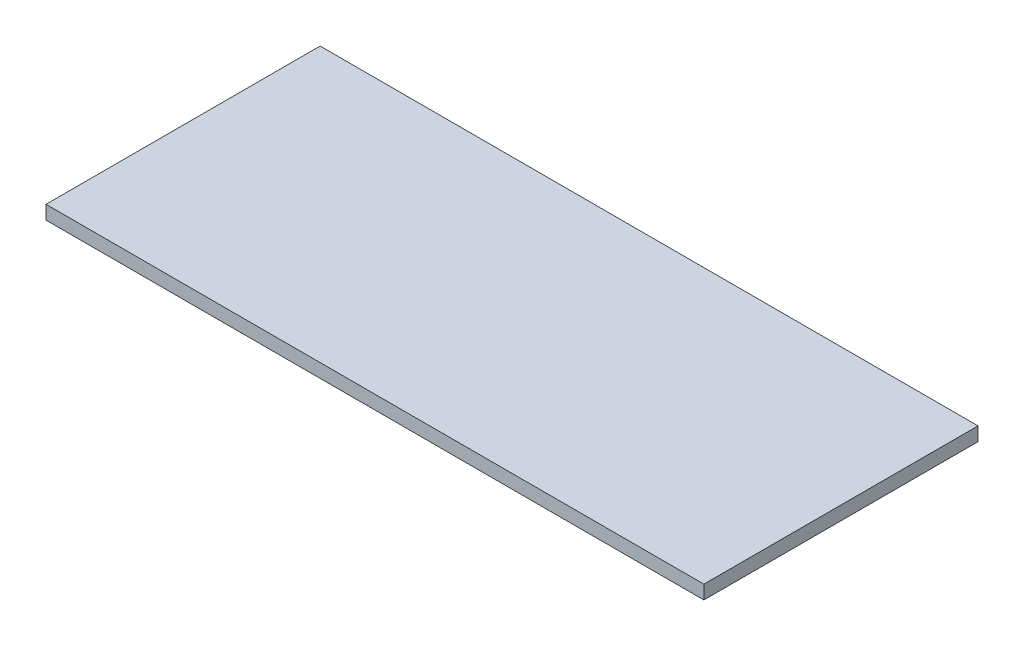
ISO-10303-21;
HEADER;
FILE_DESCRIPTION(('STEP AP214'),'2;1');
FILE_NAME('part.step','',(''),(''),'','','');
FILE_SCHEMA(('AUTOMOTIVE_DESIGN { 1 0 10303 214 1 1 1 1 }'));
ENDSEC;
DATA;
#1=APPLICATION_CONTEXT('core data for automotive mechanical design processes');
#2=APPLICATION_PROTOCOL_DEFINITION('international standard','automotive_design',2000,#1);
#3=PRODUCT_CONTEXT('',#1,'mechanical');
#4=PRODUCT('Part','Part','',(#3));
#5=PRODUCT_RELATED_PRODUCT_CATEGORY('part','',(#4));
#6=PRODUCT_DEFINITION_FORMATION('','',#4);
#7=PRODUCT_DEFINITION_CONTEXT('part definition',#1,'design');
#8=PRODUCT_DEFINITION('design','',#6,#7);
#9=PRODUCT_DEFINITION_SHAPE('','',#8);
#10=(LENGTH_UNIT() NAMED_UNIT(*) SI_UNIT(.MILLI.,.METRE.));
#11=(NAMED_UNIT(*) PLANE_ANGLE_UNIT() SI_UNIT($,.RADIAN.));
#12=(NAMED_UNIT(*) SI_UNIT($,.STERADIAN.) SOLID_ANGLE_UNIT());
#13=UNCERTAINTY_MEASURE_WITH_UNIT(LENGTH_MEASURE(1.E-05),#10,'distance_accuracy_value','');
#14=(GEOMETRIC_REPRESENTATION_CONTEXT(3) GLOBAL_UNCERTAINTY_ASSIGNED_CONTEXT((#13)) GLOBAL_UNIT_ASSIGNED_CONTEXT((#10,
#11,#12)) REPRESENTATION_CONTEXT('',''));
#15=CARTESIAN_POINT('',(0.,0.,0.));
#16=DIRECTION('',(0.,0.,1.));
#17=DIRECTION('',(1.,0.,0.));
#18=AXIS2_PLACEMENT_3D('',#15,#16,#17);
#19=CARTESIAN_POINT('',(0.,0.,100.));
#20=DIRECTION('',(-1.,0.,0.));
#21=DIRECTION('',(0.,0.,1.));
#22=AXIS2_PLACEMENT_3D('',#19,#20,#21);
#23=PLANE('',#22);
#24=DIRECTION('',(0.,1.,0.));
#25=VECTOR('',#24,1.);
#26=CARTESIAN_POINT('',(0.,0.,0.));
#27=LINE('',#26,#25);
#28=CARTESIAN_POINT('',(0.,0.,0.));
#29=VERTEX_POINT('',#28);
#30=CARTESIAN_POINT('',(0.,5.,0.));
#31=VERTEX_POINT('',#30);
#32=EDGE_CURVE('E116',#29,#31,#27,.T.);
#33=ORIENTED_EDGE('',*,*,#32,.F.);
#34=DIRECTION('',(0.,0.,-1.));
#35=VECTOR('',#34,1.);
#36=CARTESIAN_POINT('',(0.,0.,100.));
#37=LINE('',#36,#35);
#38=CARTESIAN_POINT('',(0.,0.,100.));
#39=VERTEX_POINT('',#38);
#40=EDGE_CURVE('E11',#39,#29,#37,.T.);
#41=ORIENTED_EDGE('',*,*,#40,.F.);
#42=DIRECTION('',(0.,1.,0.));
#43=VECTOR('',#42,1.);
#44=CARTESIAN_POINT('',(0.,0.,100.));
#45=LINE('',#44,#43);
#46=CARTESIAN_POINT('',(0.,5.,100.));
#47=VERTEX_POINT('',#46);
#48=EDGE_CURVE('E108',#39,#47,#45,.T.);
#49=ORIENTED_EDGE('',*,*,#48,.T.);
#50=DIRECTION('',(0.,0.,-1.));
#51=VECTOR('',#50,1.);
#52=CARTESIAN_POINT('',(0.,5.,100.));
#53=LINE('',#52,#51);
#54=EDGE_CURVE('E48',#47,#31,#53,.T.);
#55=ORIENTED_EDGE('',*,*,#54,.T.);
#56=EDGE_LOOP('',(#33,#41,#49,#55));
#57=FACE_BOUND('',#56,.T.);
#58=ADVANCED_FACE('F44',(#57),#23,.T.);
#59=CARTESIAN_POINT('',(0.,0.,100.));
#60=DIRECTION('',(0.,1.,0.));
#61=DIRECTION('',(0.,0.,1.));
#62=AXIS2_PLACEMENT_3D('',#59,#60,#61);
#63=PLANE('',#62);
#64=DIRECTION('',(1.,0.,0.));
#65=VECTOR('',#64,1.);
#66=CARTESIAN_POINT('',(0.,0.,0.));
#67=LINE('',#66,#65);
#68=CARTESIAN_POINT('',(240.,0.,0.));
#69=VERTEX_POINT('',#68);
#70=EDGE_CURVE('E80',#29,#69,#67,.T.);
#71=ORIENTED_EDGE('',*,*,#70,.T.);
#72=DIRECTION('',(0.,0.,-1.));
#73=VECTOR('',#72,1.);
#74=CARTESIAN_POINT('',(240.,0.,100.));
#75=LINE('',#74,#73);
#76=CARTESIAN_POINT('',(240.,0.,100.));
#77=VERTEX_POINT('',#76);
#78=EDGE_CURVE('E54',#77,#69,#75,.T.);
#79=ORIENTED_EDGE('',*,*,#78,.F.);
#80=DIRECTION('',(1.,0.,0.));
#81=VECTOR('',#80,1.);
#82=CARTESIAN_POINT('',(0.,0.,100.));
#83=LINE('',#82,#81);
#84=EDGE_CURVE('E96',#39,#77,#83,.T.);
#85=ORIENTED_EDGE('',*,*,#84,.F.);
#86=ORIENTED_EDGE('',*,*,#40,.T.);
#87=EDGE_LOOP('',(#71,#79,#85,#86));
#88=FACE_BOUND('',#87,.T.);
#89=ADVANCED_FACE('F135',(#88),#63,.F.);
#90=CARTESIAN_POINT('',(240.,0.,100.));
#91=DIRECTION('',(-1.,0.,0.));
#92=DIRECTION('',(0.,0.,1.));
#93=AXIS2_PLACEMENT_3D('',#90,#91,#92);
#94=PLANE('',#93);
#95=DIRECTION('',(0.,1.,0.));
#96=VECTOR('',#95,1.);
#97=CARTESIAN_POINT('',(240.,0.,0.));
#98=LINE('',#97,#96);
#99=CARTESIAN_POINT('',(240.,5.,0.));
#100=VERTEX_POINT('',#99);
#101=EDGE_CURVE('E101',#69,#100,#98,.T.);
#102=ORIENTED_EDGE('',*,*,#101,.T.);
#103=DIRECTION('',(0.,0.,-1.));
#104=VECTOR('',#103,1.);
#105=CARTESIAN_POINT('',(240.,5.,100.));
#106=LINE('',#105,#104);
#107=CARTESIAN_POINT('',(240.,5.,100.));
#108=VERTEX_POINT('',#107);
#109=EDGE_CURVE('E102',#108,#100,#106,.T.);
#110=ORIENTED_EDGE('',*,*,#109,.F.);
#111=DIRECTION('',(0.,1.,0.));
#112=VECTOR('',#111,1.);
#113=CARTESIAN_POINT('',(240.,0.,100.));
#114=LINE('',#113,#112);
#115=EDGE_CURVE('E91',#77,#108,#114,.T.);
#116=ORIENTED_EDGE('',*,*,#115,.F.);
#117=ORIENTED_EDGE('',*,*,#78,.T.);
#118=EDGE_LOOP('',(#102,#110,#116,#117));
#119=FACE_BOUND('',#118,.T.);
#120=ADVANCED_FACE('F105',(#119),#94,.F.);
#121=CARTESIAN_POINT('',(0.,5.,100.));
#122=DIRECTION('',(0.,1.,0.));
#123=DIRECTION('',(0.,0.,1.));
#124=AXIS2_PLACEMENT_3D('',#121,#122,#123);
#125=PLANE('',#124);
#126=DIRECTION('',(1.,0.,0.));
#127=VECTOR('',#126,1.);
#128=CARTESIAN_POINT('',(0.,5.,0.));
#129=LINE('',#128,#127);
#130=EDGE_CURVE('E120',#31,#100,#129,.T.);
#131=ORIENTED_EDGE('',*,*,#130,.F.);
#132=ORIENTED_EDGE('',*,*,#54,.F.);
#133=DIRECTION('',(1.,0.,0.));
#134=VECTOR('',#133,1.);
#135=CARTESIAN_POINT('',(0.,5.,100.));
#136=LINE('',#135,#134);
#137=EDGE_CURVE('E94',#47,#108,#136,.T.);
#138=ORIENTED_EDGE('',*,*,#137,.T.);
#139=ORIENTED_EDGE('',*,*,#109,.T.);
#140=EDGE_LOOP('',(#131,#132,#138,#139));
#141=FACE_BOUND('',#140,.T.);
#142=ADVANCED_FACE('F107',(#141),#125,.T.);
#143=CARTESIAN_POINT('',(0.,0.,100.));
#144=DIRECTION('',(0.,0.,-1.));
#145=DIRECTION('',(-1.,0.,0.));
#146=AXIS2_PLACEMENT_3D('',#143,#144,#145);
#147=PLANE('',#146);
#148=ORIENTED_EDGE('',*,*,#48,.F.);
#149=ORIENTED_EDGE('',*,*,#84,.T.);
#150=ORIENTED_EDGE('',*,*,#115,.T.);
#151=ORIENTED_EDGE('',*,*,#137,.F.);
#152=EDGE_LOOP('',(#148,#149,#150,#151));
#153=FACE_BOUND('',#152,.T.);
#154=ADVANCED_FACE('F92',(#153),#147,.F.);
#155=CARTESIAN_POINT('',(0.,0.,0.));
#156=DIRECTION('',(0.,0.,-1.));
#157=DIRECTION('',(-1.,0.,0.));
#158=AXIS2_PLACEMENT_3D('',#155,#156,#157);
#159=PLANE('',#158);
#160=ORIENTED_EDGE('',*,*,#32,.T.);
#161=ORIENTED_EDGE('',*,*,#130,.T.);
#162=ORIENTED_EDGE('',*,*,#101,.F.);
#163=ORIENTED_EDGE('',*,*,#70,.F.);
#164=EDGE_LOOP('',(#160,#161,#162,#163));
#165=FACE_BOUND('',#164,.T.);
#166=ADVANCED_FACE('F129',(#165),#159,.T.);
#167=CLOSED_SHELL('',(#58,#89,#120,#142,#154,#166));
#168=MANIFOLD_SOLID_BREP('B2',#167);
#169=ADVANCED_BREP_SHAPE_REPRESENTATION('',(#18,#168),#14);
#170=SHAPE_DEFINITION_REPRESENTATION(#9,#169);
ENDSEC;
END-ISO-10303-21;
